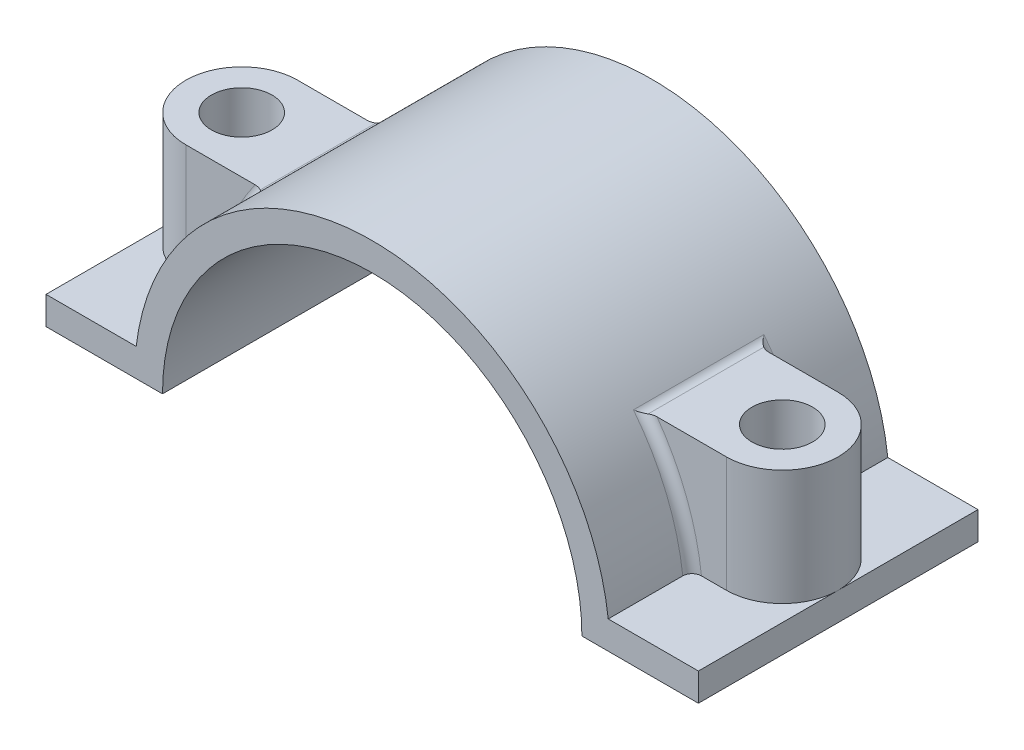
ISO-10303-21;
HEADER;
FILE_DESCRIPTION(('STEP AP214'),'2;1');
FILE_NAME('part.step','',(''),(''),'','','');
FILE_SCHEMA(('AUTOMOTIVE_DESIGN { 1 0 10303 214 1 1 1 1 }'));
ENDSEC;
DATA;
#1=APPLICATION_CONTEXT('core data for automotive mechanical design processes');
#2=APPLICATION_PROTOCOL_DEFINITION('international standard','automotive_design',2000,#1);
#3=PRODUCT_CONTEXT('',#1,'mechanical');
#4=PRODUCT('Part','Part','',(#3));
#5=PRODUCT_RELATED_PRODUCT_CATEGORY('part','',(#4));
#6=PRODUCT_DEFINITION_FORMATION('','',#4);
#7=PRODUCT_DEFINITION_CONTEXT('part definition',#1,'design');
#8=PRODUCT_DEFINITION('design','',#6,#7);
#9=PRODUCT_DEFINITION_SHAPE('','',#8);
#10=(LENGTH_UNIT() NAMED_UNIT(*) SI_UNIT(.MILLI.,.METRE.));
#11=(NAMED_UNIT(*) PLANE_ANGLE_UNIT() SI_UNIT($,.RADIAN.));
#12=(NAMED_UNIT(*) SI_UNIT($,.STERADIAN.) SOLID_ANGLE_UNIT());
#13=UNCERTAINTY_MEASURE_WITH_UNIT(LENGTH_MEASURE(1.E-05),#10,'distance_accuracy_value','');
#14=(GEOMETRIC_REPRESENTATION_CONTEXT(3) GLOBAL_UNCERTAINTY_ASSIGNED_CONTEXT((#13)) GLOBAL_UNIT_ASSIGNED_CONTEXT((#10,
#11,#12)) REPRESENTATION_CONTEXT('',''));
#15=CARTESIAN_POINT('',(0.,0.,0.));
#16=DIRECTION('',(0.,0.,1.));
#17=DIRECTION('',(1.,0.,0.));
#18=AXIS2_PLACEMENT_3D('',#15,#16,#17);
#19=CARTESIAN_POINT('',(-20.8156191356395,16.4,15.));
#20=DIRECTION('',(0.,0.,-1.));
#21=DIRECTION('',(-1.,0.,0.));
#22=AXIS2_PLACEMENT_3D('',#19,#20,#21);
#23=CYLINDRICAL_SURFACE('',#22,1.);
#24=CARTESIAN_POINT('',(-20.8156191356395,15.4,-6.20526054605057));
#25=CARTESIAN_POINT('',(-20.7790423955795,15.4000104684533,-6.22772458048017));
#26=CARTESIAN_POINT('',(-20.7432427208585,15.4020056715523,-6.25134656748978));
#27=CARTESIAN_POINT('',(-20.6734220101004,15.4095380975103,-6.30041681433598));
#28=CARTESIAN_POINT('',(-20.6393970203107,15.4150670480879,-6.325860686057));
#29=CARTESIAN_POINT('',(-20.573320367646,15.4292130596014,-6.37808157374734));
#30=CARTESIAN_POINT('',(-20.5412608609801,15.4378167625495,-6.40485239817953));
#31=CARTESIAN_POINT('',(-20.4790013902384,15.4577913917376,-6.45952765497965));
#32=CARTESIAN_POINT('',(-20.4488028796518,15.4691644474374,-6.48743294586012));
#33=CARTESIAN_POINT('',(-20.3410342500515,15.5156380340275,-6.59184700810215));
#34=CARTESIAN_POINT('',(-20.26931149113,15.5584479735794,-6.67108325177053));
#35=CARTESIAN_POINT('',(-20.1401526063457,15.6581165614313,-6.83208238582654));
#36=CARTESIAN_POINT('',(-20.0827128819923,15.7149716639601,-6.91384463396061));
#37=CARTESIAN_POINT('',(-20.0319539065668,15.7788148758067,-6.99699008960604));
#38=CARTESIAN_POINT('',(-20.031037697461,15.7799724883255,-6.99849506987035));
#39=CARTESIAN_POINT('',(-20.0301240739172,15.7811320754717,-7.));
#40=B_SPLINE_CURVE_WITH_KNOTS('',3,(#24,#25,#26,#27,#28,#29,#30,#31,#32,#33,#34,#35,#36,#37,#38,
#39),.UNSPECIFIED.,.F.,.F.,(4,2,2,2,2,2,2,4),(0.,0.128623315064683,0.256946628373384,
0.384719097488644,0.512590127663204,0.855754832598932,1.19883299227289,1.20515755519786),.UNSPECIFIED.);
#41=CARTESIAN_POINT('',(-20.8156191356395,15.4,-6.20526054605057));
#42=VERTEX_POINT('',#41);
#43=CARTESIAN_POINT('',(-20.0301240739172,15.7811320754717,-7.));
#44=VERTEX_POINT('',#43);
#45=EDGE_CURVE('E11',#42,#44,#40,.T.);
#46=ORIENTED_EDGE('',*,*,#45,.F.);
#47=DIRECTION('',(0.,0.,-1.));
#48=VECTOR('',#47,1.);
#49=CARTESIAN_POINT('',(-20.8156191356395,15.4,0.));
#50=LINE('',#49,#48);
#51=CARTESIAN_POINT('',(-20.8156191356395,15.4,6.20526054605057));
#52=VERTEX_POINT('',#51);
#53=EDGE_CURVE('E58',#52,#42,#50,.T.);
#54=ORIENTED_EDGE('',*,*,#53,.F.);
#55=CARTESIAN_POINT('',(-20.8156191356395,15.4,6.20526054605057));
#56=CARTESIAN_POINT('',(-20.7790423955795,15.4000104684533,6.22772458048016));
#57=CARTESIAN_POINT('',(-20.7432427208585,15.4020056715523,6.25134656748979));
#58=CARTESIAN_POINT('',(-20.6734220101004,15.4095380975103,6.300416814336));
#59=CARTESIAN_POINT('',(-20.6393970203107,15.4150670480879,6.32586068605703));
#60=CARTESIAN_POINT('',(-20.573320367646,15.4292130596014,6.37808157374736));
#61=CARTESIAN_POINT('',(-20.5412608609801,15.4378167625495,6.40485239817953));
#62=CARTESIAN_POINT('',(-20.4790013902384,15.4577913917376,6.45952765497967));
#63=CARTESIAN_POINT('',(-20.4488028796518,15.4691644474374,6.48743294586018));
#64=CARTESIAN_POINT('',(-20.3410342500514,15.5156380340276,6.591847008102));
#65=CARTESIAN_POINT('',(-20.2693114911294,15.5584479735801,6.67108325176955));
#66=CARTESIAN_POINT('',(-20.1401526063463,15.6581165614306,6.83208238582751));
#67=CARTESIAN_POINT('',(-20.0827128819947,15.7149716639571,6.91384463396438));
#68=CARTESIAN_POINT('',(-20.0319539065669,15.7788148758066,6.99699008960618));
#69=CARTESIAN_POINT('',(-20.0310376974611,15.7799724883255,6.99849506987042));
#70=CARTESIAN_POINT('',(-20.0301240739172,15.7811320754717,7.));
#71=B_SPLINE_CURVE_WITH_KNOTS('',3,(#55,#56,#57,#58,#59,#60,#61,#62,#63,#64,#65,#66,#67,#68,#69,
#70),.UNSPECIFIED.,.F.,.F.,(4,2,2,2,2,2,2,4),(0.,0.1286233150647,0.256946628373422,
0.384719097488662,0.512590127663204,0.855754832598924,1.19883299227289,1.20515755519786),.UNSPECIFIED.);
#72=CARTESIAN_POINT('',(-20.0301240739172,15.7811320754717,7.));
#73=VERTEX_POINT('',#72);
#74=EDGE_CURVE('E51',#52,#73,#71,.T.);
#75=ORIENTED_EDGE('',*,*,#74,.T.);
#76=DIRECTION('',(0.,0.,-1.));
#77=VECTOR('',#76,1.);
#78=CARTESIAN_POINT('',(-20.0301240739172,15.7811320754717,15.));
#79=LINE('',#78,#77);
#80=EDGE_CURVE('E583',#44,#73,#79,.F.);
#81=ORIENTED_EDGE('',*,*,#80,.F.);
#82=EDGE_LOOP('',(#46,#54,#75,#81));
#83=FACE_BOUND('',#82,.T.);
#84=ADVANCED_FACE('F38',(#83),#23,.F.);
#85=CARTESIAN_POINT('',(0.,0.,7.));
#86=DIRECTION('',(0.,0.,1.));
#87=DIRECTION('',(1.,0.,0.));
#88=AXIS2_PLACEMENT_3D('',#85,#86,#87);
#89=TOROIDAL_SURFACE('',#88,26.5,1.);
#90=ORIENTED_EDGE('',*,*,#74,.F.);
#91=CARTESIAN_POINT('',(-21.5659453769131,15.4,6.));
#92=CARTESIAN_POINT('',(-21.4800510751369,15.4,6.00001819834029));
#93=CARTESIAN_POINT('',(-21.3939987315737,15.4,6.00733615476593));
#94=CARTESIAN_POINT('',(-21.2264695965319,15.4,6.03626973627718));
#95=CARTESIAN_POINT('',(-21.1449326183364,15.4,6.05753994004215));
#96=CARTESIAN_POINT('',(-21.0226236279216,15.4,6.10131580582368));
#97=CARTESIAN_POINT('',(-20.9800688754925,15.4,6.11892696704098));
#98=CARTESIAN_POINT('',(-20.8964315910126,15.4,6.15867074133601));
#99=CARTESIAN_POINT('',(-20.8553763535309,15.4,6.18086066435772));
#100=CARTESIAN_POINT('',(-20.8156191356395,15.4,6.20526054605058));
#101=B_SPLINE_CURVE_WITH_KNOTS('',3,(#91,#92,#93,#94,#95,#96,#97,#98,#99,#100),.UNSPECIFIED.,
.F.,.F.,(4,2,2,2,4),(0.,0.257661941413872,0.50917408393543,0.647119728197683,0.786909918548286),.UNSPECIFIED.);
#102=CARTESIAN_POINT('',(-21.5659453769131,15.4,6.));
#103=VERTEX_POINT('',#102);
#104=EDGE_CURVE('E477',#103,#52,#101,.T.);
#105=ORIENTED_EDGE('',*,*,#104,.F.);
#106=CARTESIAN_POINT('',(0.,0.,6.));
#107=DIRECTION('',(0.,0.,1.));
#108=DIRECTION('',(1.,0.,0.));
#109=AXIS2_PLACEMENT_3D('',#106,#107,#108);
#110=CIRCLE('',#109,26.5);
#111=CARTESIAN_POINT('',(-26.3296410913632,3.,6.));
#112=VERTEX_POINT('',#111);
#113=EDGE_CURVE('E588',#112,#103,#110,.F.);
#114=ORIENTED_EDGE('',*,*,#113,.F.);
#115=CARTESIAN_POINT('',(-25.3229145242012,3.,7.));
#116=CARTESIAN_POINT('',(-25.3229146030695,3.,6.97200553198436));
#117=CARTESIAN_POINT('',(-25.3240990317966,3.,6.9440245268497));
#118=CARTESIAN_POINT('',(-25.3288234709458,3.,6.8882638723931));
#119=CARTESIAN_POINT('',(-25.3323633345418,3.,6.86048421062953));
#120=CARTESIAN_POINT('',(-25.3464792130386,3.,6.77780559336661));
#121=CARTESIAN_POINT('',(-25.3605516283502,3.,6.72346226824656));
#122=CARTESIAN_POINT('',(-25.3976134393538,3.,6.61791391386901));
#123=CARTESIAN_POINT('',(-25.420606488926,3.,6.56671018054942));
#124=CARTESIAN_POINT('',(-25.4748348297795,3.,6.46887243445492));
#125=CARTESIAN_POINT('',(-25.5060691439918,3.,6.42223788086477));
#126=CARTESIAN_POINT('',(-25.5759860524003,3.,6.334698208803));
#127=CARTESIAN_POINT('',(-25.6146915828095,3.,6.29381142147844));
#128=CARTESIAN_POINT('',(-25.6983864024311,3.,6.21905662929826));
#129=CARTESIAN_POINT('',(-25.7433770049755,3.,6.18519009508155));
#130=CARTESIAN_POINT('',(-25.8386754767127,3.,6.12520795238575));
#131=CARTESIAN_POINT('',(-25.8890169551633,3.,6.09914580094579));
#132=CARTESIAN_POINT('',(-25.993334704315,3.,6.05579884092153));
#133=CARTESIAN_POINT('',(-26.0473091559854,3.,6.03850967618809));
#134=CARTESIAN_POINT('',(-26.1395865249041,3.,6.01725243447755));
#135=CARTESIAN_POINT('',(-26.1773335799403,3.,6.01078691361844));
#136=CARTESIAN_POINT('',(-26.2532624413983,3.,6.00216105823388));
#137=CARTESIAN_POINT('',(-26.2914435605766,3.,5.9999946725953));
#138=CARTESIAN_POINT('',(-26.3296410913632,3.,6.));
#139=B_SPLINE_CURVE_WITH_KNOTS('',3,(#115,#116,#117,#118,#119,#120,#121,#122,#123,#124,#125,
#126,#127,#128,#129,#130,#131,#132,#133,#134,#135,#136,#137,#138),.UNSPECIFIED.,.F.,.F.,(4,2,2,
2,2,2,2,2,2,2,2,4),(0.,0.0839316434917921,0.167858055597521,0.335400679526094,0.503012001273137,
0.670603460256082,0.838717842173979,1.00686740605083,1.17614368611626,1.34533583108666,
1.45999665764598,1.57449598215896),.UNSPECIFIED.);
#140=CARTESIAN_POINT('',(-25.3229145242012,3.,7.));
#141=VERTEX_POINT('',#140);
#142=EDGE_CURVE('E521',#141,#112,#139,.T.);
#143=ORIENTED_EDGE('',*,*,#142,.F.);
#144=CARTESIAN_POINT('',(0.,0.,7.));
#145=DIRECTION('',(0.,0.,1.));
#146=DIRECTION('',(1.,0.,0.));
#147=AXIS2_PLACEMENT_3D('',#144,#145,#146);
#148=CIRCLE('',#147,25.5);
#149=EDGE_CURVE('E528',#73,#141,#148,.T.);
#150=ORIENTED_EDGE('',*,*,#149,.F.);
#151=EDGE_LOOP('',(#90,#105,#114,#143,#150));
#152=FACE_BOUND('',#151,.T.);
#153=ADVANCED_FACE('F497',(#152),#89,.F.);
#154=CARTESIAN_POINT('',(0.,0.,-7.));
#155=DIRECTION('',(0.,0.,-1.));
#156=DIRECTION('',(-1.,0.,0.));
#157=AXIS2_PLACEMENT_3D('',#154,#155,#156);
#158=TOROIDAL_SURFACE('',#157,26.5,1.);
#159=CARTESIAN_POINT('',(-20.8156191356395,15.4,-6.20526054605057));
#160=CARTESIAN_POINT('',(-20.8524464332746,15.4,-6.18266162688281));
#161=CARTESIAN_POINT('',(-20.8903784489619,15.4,-6.16195907669925));
#162=CARTESIAN_POINT('',(-20.968043718157,15.4,-6.12431649458518));
#163=CARTESIAN_POINT('',(-21.0077759826904,15.4,-6.10737442628364));
#164=CARTESIAN_POINT('',(-21.1271789405163,15.4,-6.062835375067));
#165=CARTESIAN_POINT('',(-21.2088642175461,15.4,-6.04044793843606));
#166=CARTESIAN_POINT('',(-21.3366541649774,15.4,-6.01679088691736));
#167=CARTESIAN_POINT('',(-21.3819261836167,15.4,-6.01054548284767));
#168=CARTESIAN_POINT('',(-21.4734331151285,15.4,-6.0021283240347));
#169=CARTESIAN_POINT('',(-21.5196729333387,15.4,-6.00000978565666));
#170=CARTESIAN_POINT('',(-21.5659453769131,15.4,-6.));
#171=B_SPLINE_CURVE_WITH_KNOTS('',3,(#159,#160,#161,#162,#163,#164,#165,#166,#167,#168,#169,
#170),.UNSPECIFIED.,.F.,.F.,(4,2,2,2,2,4),(0.,0.129481265844013,0.258892243172669,
0.511492650302673,0.648441096073207,0.787144112508083),.UNSPECIFIED.);
#172=CARTESIAN_POINT('',(-21.5659453769131,15.4,-6.));
#173=VERTEX_POINT('',#172);
#174=EDGE_CURVE('E484',#42,#173,#171,.T.);
#175=ORIENTED_EDGE('',*,*,#174,.F.);
#176=ORIENTED_EDGE('',*,*,#45,.T.);
#177=CARTESIAN_POINT('',(0.,0.,-7.));
#178=DIRECTION('',(0.,0.,-1.));
#179=DIRECTION('',(-1.,0.,0.));
#180=AXIS2_PLACEMENT_3D('',#177,#178,#179);
#181=CIRCLE('',#180,25.5);
#182=CARTESIAN_POINT('',(-25.3229145242012,3.,-7.));
#183=VERTEX_POINT('',#182);
#184=EDGE_CURVE('E597',#183,#44,#181,.T.);
#185=ORIENTED_EDGE('',*,*,#184,.F.);
#186=CARTESIAN_POINT('',(-26.3296410913629,3.,-6.));
#187=CARTESIAN_POINT('',(-26.3011811661531,3.,-6.00000028585972));
#188=CARTESIAN_POINT('',(-26.2727348538447,3.,-6.0012001227685));
#189=CARTESIAN_POINT('',(-26.2160449227091,3.,-6.00598711697197));
#190=CARTESIAN_POINT('',(-26.1878012963869,3.,-6.00957418552527));
#191=CARTESIAN_POINT('',(-26.1037170989265,3.,-6.02388463508139));
#192=CARTESIAN_POINT('',(-26.0484383430675,3.,-6.03815734028031));
#193=CARTESIAN_POINT('',(-25.9410608939852,3.,-6.07578506026414));
#194=CARTESIAN_POINT('',(-25.8889639140818,3.,-6.09914491926262));
#195=CARTESIAN_POINT('',(-25.7894489428435,3.,-6.15429943818504));
#196=CARTESIAN_POINT('',(-25.7420299075289,3.,-6.18609221026186));
#197=CARTESIAN_POINT('',(-25.6533636711956,3.,-6.25713073622443));
#198=CARTESIAN_POINT('',(-25.6120999525838,3.,-6.29635587828004));
#199=CARTESIAN_POINT('',(-25.5367850837961,3.,-6.38122612414712));
#200=CARTESIAN_POINT('',(-25.5027352406676,3.,-6.4268723888823));
#201=CARTESIAN_POINT('',(-25.4430522145314,3.,-6.52297854867846));
#202=CARTESIAN_POINT('',(-25.4173690011233,3.,-6.57340741178362));
#203=CARTESIAN_POINT('',(-25.3749089829741,3.,-6.67786834307877));
#204=CARTESIAN_POINT('',(-25.3581260831311,3.,-6.73189791681813));
#205=CARTESIAN_POINT('',(-25.3383540839355,3.,-6.82191189646598));
#206=CARTESIAN_POINT('',(-25.3325677367698,3.,-6.85730642554541));
#207=CARTESIAN_POINT('',(-25.3248486463745,3.,-6.92846209244694));
#208=CARTESIAN_POINT('',(-25.3229104275276,3.,-6.96422263646809));
#209=CARTESIAN_POINT('',(-25.3229145242012,3.,-7.));
#210=B_SPLINE_CURVE_WITH_KNOTS('',3,(#186,#187,#188,#189,#190,#191,#192,#193,#194,#195,#196,
#197,#198,#199,#200,#201,#202,#203,#204,#205,#206,#207,#208,#209),.UNSPECIFIED.,.F.,.F.,(4,2,2,
2,2,2,2,2,2,2,2,4),(0.,0.0853274391699519,0.170651706610478,0.341048874701205,0.511537003498997,
0.681986997873824,0.851971032591822,1.0219858396129,1.19096449614879,1.3598272830061,
1.46722706536691,1.57447391550913),.UNSPECIFIED.);
#211=CARTESIAN_POINT('',(-26.3296410913629,3.,-6.));
#212=VERTEX_POINT('',#211);
#213=EDGE_CURVE('E502',#212,#183,#210,.T.);
#214=ORIENTED_EDGE('',*,*,#213,.F.);
#215=CARTESIAN_POINT('',(0.,0.,-6.));
#216=DIRECTION('',(0.,0.,-1.));
#217=DIRECTION('',(-1.,0.,0.));
#218=AXIS2_PLACEMENT_3D('',#215,#216,#217);
#219=CIRCLE('',#218,26.5);
#220=EDGE_CURVE('E509',#173,#212,#219,.F.);
#221=ORIENTED_EDGE('',*,*,#220,.F.);
#222=EDGE_LOOP('',(#175,#176,#185,#214,#221));
#223=FACE_BOUND('',#222,.T.);
#224=ADVANCED_FACE('F494',(#223),#158,.F.);
#225=CARTESIAN_POINT('',(20.8156191356395,16.4,15.));
#226=DIRECTION('',(0.,0.,-1.));
#227=DIRECTION('',(-1.,0.,0.));
#228=AXIS2_PLACEMENT_3D('',#225,#226,#227);
#229=CYLINDRICAL_SURFACE('',#228,1.);
#230=CARTESIAN_POINT('',(20.8156191356395,15.4,6.20526054605057));
#231=CARTESIAN_POINT('',(20.7790423955795,15.4000104684533,6.22772458048016));
#232=CARTESIAN_POINT('',(20.7432427208585,15.4020056715523,6.25134656748979));
#233=CARTESIAN_POINT('',(20.6734220101004,15.4095380975103,6.300416814336));
#234=CARTESIAN_POINT('',(20.6393970203107,15.4150670480879,6.32586068605703));
#235=CARTESIAN_POINT('',(20.573320367646,15.4292130596014,6.37808157374736));
#236=CARTESIAN_POINT('',(20.5412608609801,15.4378167625495,6.40485239817953));
#237=CARTESIAN_POINT('',(20.4790013902384,15.4577913917376,6.45952765497967));
#238=CARTESIAN_POINT('',(20.4488028796518,15.4691644474374,6.48743294586018));
#239=CARTESIAN_POINT('',(20.3410342500514,15.5156380340276,6.591847008102));
#240=CARTESIAN_POINT('',(20.2693114911294,15.5584479735801,6.67108325176955));
#241=CARTESIAN_POINT('',(20.1401526063463,15.6581165614306,6.83208238582751));
#242=CARTESIAN_POINT('',(20.0827128819947,15.7149716639571,6.91384463396438));
#243=CARTESIAN_POINT('',(20.0319539065669,15.7788148758066,6.99699008960618));
#244=CARTESIAN_POINT('',(20.0310376974611,15.7799724883255,6.99849506987042));
#245=CARTESIAN_POINT('',(20.0301240739172,15.7811320754717,7.));
#246=B_SPLINE_CURVE_WITH_KNOTS('',3,(#230,#231,#232,#233,#234,#235,#236,#237,#238,#239,#240,
#241,#242,#243,#244,#245),.UNSPECIFIED.,.F.,.F.,(4,2,2,2,2,2,2,4),(0.,0.1286233150647,
0.256946628373422,0.384719097488662,0.512590127663204,0.855754832598924,1.19883299227289,
1.20515755519786),.UNSPECIFIED.);
#247=CARTESIAN_POINT('',(20.8156191356395,15.4,6.20526054605057));
#248=VERTEX_POINT('',#247);
#249=CARTESIAN_POINT('',(20.0301240739172,15.7811320754717,7.));
#250=VERTEX_POINT('',#249);
#251=EDGE_CURVE('E603',#248,#250,#246,.T.);
#252=ORIENTED_EDGE('',*,*,#251,.F.);
#253=DIRECTION('',(0.,0.,-1.));
#254=VECTOR('',#253,1.);
#255=CARTESIAN_POINT('',(20.8156191356395,15.4,0.));
#256=LINE('',#255,#254);
#257=CARTESIAN_POINT('',(20.8156191356395,15.4,-6.20526054605057));
#258=VERTEX_POINT('',#257);
#259=EDGE_CURVE('E387',#258,#248,#256,.F.);
#260=ORIENTED_EDGE('',*,*,#259,.F.);
#261=CARTESIAN_POINT('',(20.8156191356395,15.4,-6.20526054605057));
#262=CARTESIAN_POINT('',(20.7790423955795,15.4000104684533,-6.22772458048017));
#263=CARTESIAN_POINT('',(20.7432427208585,15.4020056715523,-6.25134656748978));
#264=CARTESIAN_POINT('',(20.6734220101004,15.4095380975103,-6.30041681433598));
#265=CARTESIAN_POINT('',(20.6393970203107,15.4150670480879,-6.325860686057));
#266=CARTESIAN_POINT('',(20.573320367646,15.4292130596014,-6.37808157374734));
#267=CARTESIAN_POINT('',(20.5412608609801,15.4378167625495,-6.40485239817953));
#268=CARTESIAN_POINT('',(20.4790013902384,15.4577913917376,-6.45952765497965));
#269=CARTESIAN_POINT('',(20.4488028796518,15.4691644474374,-6.48743294586012));
#270=CARTESIAN_POINT('',(20.3410342500515,15.5156380340275,-6.59184700810215));
#271=CARTESIAN_POINT('',(20.26931149113,15.5584479735794,-6.67108325177053));
#272=CARTESIAN_POINT('',(20.1401526063457,15.6581165614313,-6.83208238582654));
#273=CARTESIAN_POINT('',(20.0827128819923,15.7149716639601,-6.91384463396061));
#274=CARTESIAN_POINT('',(20.0319539065668,15.7788148758067,-6.99699008960604));
#275=CARTESIAN_POINT('',(20.031037697461,15.7799724883255,-6.99849506987035));
#276=CARTESIAN_POINT('',(20.0301240739172,15.7811320754717,-7.));
#277=B_SPLINE_CURVE_WITH_KNOTS('',3,(#261,#262,#263,#264,#265,#266,#267,#268,#269,#270,#271,
#272,#273,#274,#275,#276),.UNSPECIFIED.,.F.,.F.,(4,2,2,2,2,2,2,4),(0.,0.128623315064683,
0.256946628373384,0.384719097488644,0.512590127663204,0.855754832598932,1.19883299227289,
1.20515755519786),.UNSPECIFIED.);
#278=CARTESIAN_POINT('',(20.0301240739172,15.7811320754717,-7.));
#279=VERTEX_POINT('',#278);
#280=EDGE_CURVE('E436',#258,#279,#277,.T.);
#281=ORIENTED_EDGE('',*,*,#280,.T.);
#282=DIRECTION('',(0.,0.,-1.));
#283=VECTOR('',#282,1.);
#284=CARTESIAN_POINT('',(20.0301240739172,15.7811320754717,15.));
#285=LINE('',#284,#283);
#286=EDGE_CURVE('E370',#250,#279,#285,.T.);
#287=ORIENTED_EDGE('',*,*,#286,.F.);
#288=EDGE_LOOP('',(#252,#260,#281,#287));
#289=FACE_BOUND('',#288,.T.);
#290=ADVANCED_FACE('F423',(#289),#229,.F.);
#291=CARTESIAN_POINT('',(0.,0.,-7.));
#292=DIRECTION('',(0.,0.,1.));
#293=DIRECTION('',(1.,0.,0.));
#294=AXIS2_PLACEMENT_3D('',#291,#292,#293);
#295=TOROIDAL_SURFACE('',#294,26.5,1.);
#296=ORIENTED_EDGE('',*,*,#280,.F.);
#297=CARTESIAN_POINT('',(21.5659453769131,15.4,-6.));
#298=CARTESIAN_POINT('',(21.4800510751369,15.4,-6.00001819834029));
#299=CARTESIAN_POINT('',(21.3939987315737,15.4,-6.00733615476593));
#300=CARTESIAN_POINT('',(21.2264695965319,15.4,-6.03626973627718));
#301=CARTESIAN_POINT('',(21.1449326183364,15.4,-6.05753994004215));
#302=CARTESIAN_POINT('',(21.0226236279216,15.4,-6.10131580582368));
#303=CARTESIAN_POINT('',(20.9800688754925,15.4,-6.11892696704098));
#304=CARTESIAN_POINT('',(20.8964315910126,15.4,-6.15867074133601));
#305=CARTESIAN_POINT('',(20.8553763535309,15.4,-6.18086066435772));
#306=CARTESIAN_POINT('',(20.8156191356395,15.4,-6.20526054605058));
#307=B_SPLINE_CURVE_WITH_KNOTS('',3,(#297,#298,#299,#300,#301,#302,#303,#304,#305,#306),
.UNSPECIFIED.,.F.,.F.,(4,2,2,2,4),(0.,0.257661941413872,0.50917408393543,0.647119728197683,
0.786909918548286),.UNSPECIFIED.);
#308=CARTESIAN_POINT('',(21.5659453769131,15.4,-6.));
#309=VERTEX_POINT('',#308);
#310=EDGE_CURVE('E412',#309,#258,#307,.T.);
#311=ORIENTED_EDGE('',*,*,#310,.F.);
#312=CARTESIAN_POINT('',(0.,0.,-6.));
#313=DIRECTION('',(0.,0.,1.));
#314=DIRECTION('',(1.,0.,0.));
#315=AXIS2_PLACEMENT_3D('',#312,#313,#314);
#316=CIRCLE('',#315,26.5);
#317=CARTESIAN_POINT('',(26.3296410913629,3.,-6.));
#318=VERTEX_POINT('',#317);
#319=EDGE_CURVE('E362',#318,#309,#316,.T.);
#320=ORIENTED_EDGE('',*,*,#319,.F.);
#321=CARTESIAN_POINT('',(25.3229145242012,3.,-7.));
#322=CARTESIAN_POINT('',(25.3229146030695,3.,-6.97200553198436));
#323=CARTESIAN_POINT('',(25.3240990317966,3.,-6.9440245268497));
#324=CARTESIAN_POINT('',(25.3288234709458,3.,-6.8882638723931));
#325=CARTESIAN_POINT('',(25.3323633345418,3.,-6.86048421062953));
#326=CARTESIAN_POINT('',(25.3464792130386,3.,-6.77780559336661));
#327=CARTESIAN_POINT('',(25.3605516283502,3.,-6.72346226824656));
#328=CARTESIAN_POINT('',(25.3976134393538,3.,-6.61791391386901));
#329=CARTESIAN_POINT('',(25.420606488926,3.,-6.56671018054942));
#330=CARTESIAN_POINT('',(25.4748348297795,3.,-6.46887243445492));
#331=CARTESIAN_POINT('',(25.5060691439918,3.,-6.42223788086477));
#332=CARTESIAN_POINT('',(25.5759860524003,3.,-6.334698208803));
#333=CARTESIAN_POINT('',(25.6146915828095,3.,-6.29381142147844));
#334=CARTESIAN_POINT('',(25.6983864024311,3.,-6.21905662929826));
#335=CARTESIAN_POINT('',(25.7433770049755,3.,-6.18519009508155));
#336=CARTESIAN_POINT('',(25.8386754767127,3.,-6.12520795238575));
#337=CARTESIAN_POINT('',(25.8890169551633,3.,-6.09914580094579));
#338=CARTESIAN_POINT('',(25.993334704315,3.,-6.05579884092153));
#339=CARTESIAN_POINT('',(26.0473091559854,3.,-6.03850967618809));
#340=CARTESIAN_POINT('',(26.1395865249041,3.,-6.01725243447756));
#341=CARTESIAN_POINT('',(26.1773335799403,3.,-6.01078691361845));
#342=CARTESIAN_POINT('',(26.2532624413981,3.,-6.00216105823389));
#343=CARTESIAN_POINT('',(26.2914435605763,3.,-5.9999946725953));
#344=CARTESIAN_POINT('',(26.3296410913629,3.,-6.));
#345=B_SPLINE_CURVE_WITH_KNOTS('',3,(#321,#322,#323,#324,#325,#326,#327,#328,#329,#330,#331,
#332,#333,#334,#335,#336,#337,#338,#339,#340,#341,#342,#343,#344),.UNSPECIFIED.,.F.,.F.,(4,2,2,
2,2,2,2,2,2,2,2,4),(0.,0.0839316434917937,0.167858055597521,0.335400679526094,0.503012001273135,
0.670603460256083,0.838717842173979,1.00686740605083,1.17614368611626,1.34533583108666,
1.45999665764586,1.57449598215871),.UNSPECIFIED.);
#346=CARTESIAN_POINT('',(25.3229145242012,3.,-7.));
#347=VERTEX_POINT('',#346);
#348=EDGE_CURVE('E378',#347,#318,#345,.T.);
#349=ORIENTED_EDGE('',*,*,#348,.F.);
#350=CARTESIAN_POINT('',(0.,0.,-7.));
#351=DIRECTION('',(0.,0.,1.));
#352=DIRECTION('',(1.,0.,0.));
#353=AXIS2_PLACEMENT_3D('',#350,#351,#352);
#354=CIRCLE('',#353,25.5);
#355=EDGE_CURVE('E374',#279,#347,#354,.F.);
#356=ORIENTED_EDGE('',*,*,#355,.F.);
#357=EDGE_LOOP('',(#296,#311,#320,#349,#356));
#358=FACE_BOUND('',#357,.T.);
#359=ADVANCED_FACE('F389',(#358),#295,.F.);
#360=CARTESIAN_POINT('',(0.,0.,7.));
#361=DIRECTION('',(0.,0.,-1.));
#362=DIRECTION('',(-1.,0.,0.));
#363=AXIS2_PLACEMENT_3D('',#360,#361,#362);
#364=TOROIDAL_SURFACE('',#363,26.5,1.);
#365=CARTESIAN_POINT('',(20.8156191356395,15.4,6.20526054605057));
#366=CARTESIAN_POINT('',(20.8524464332746,15.4,6.18266162688281));
#367=CARTESIAN_POINT('',(20.8903784489619,15.4,6.16195907669925));
#368=CARTESIAN_POINT('',(20.968043718157,15.4,6.12431649458518));
#369=CARTESIAN_POINT('',(21.0077759826904,15.4,6.10737442628364));
#370=CARTESIAN_POINT('',(21.1271789405163,15.4,6.062835375067));
#371=CARTESIAN_POINT('',(21.2088642175461,15.4,6.04044793843606));
#372=CARTESIAN_POINT('',(21.3366541649774,15.4,6.01679088691736));
#373=CARTESIAN_POINT('',(21.3819261836167,15.4,6.01054548284767));
#374=CARTESIAN_POINT('',(21.4734331151285,15.4,6.0021283240347));
#375=CARTESIAN_POINT('',(21.5196729333387,15.4,6.00000978565666));
#376=CARTESIAN_POINT('',(21.5659453769131,15.4,6.));
#377=B_SPLINE_CURVE_WITH_KNOTS('',3,(#365,#366,#367,#368,#369,#370,#371,#372,#373,#374,#375,
#376),.UNSPECIFIED.,.F.,.F.,(4,2,2,2,2,4),(0.,0.129481265844013,0.258892243172669,
0.511492650302673,0.648441096073207,0.787144112508083),.UNSPECIFIED.);
#378=CARTESIAN_POINT('',(21.5659453769131,15.4,6.));
#379=VERTEX_POINT('',#378);
#380=EDGE_CURVE('E429',#248,#379,#377,.T.);
#381=ORIENTED_EDGE('',*,*,#380,.F.);
#382=ORIENTED_EDGE('',*,*,#251,.T.);
#383=CARTESIAN_POINT('',(0.,0.,7.));
#384=DIRECTION('',(0.,0.,-1.));
#385=DIRECTION('',(-1.,0.,0.));
#386=AXIS2_PLACEMENT_3D('',#383,#384,#385);
#387=CIRCLE('',#386,25.5);
#388=CARTESIAN_POINT('',(25.3229145242012,3.,7.));
#389=VERTEX_POINT('',#388);
#390=EDGE_CURVE('E366',#389,#250,#387,.F.);
#391=ORIENTED_EDGE('',*,*,#390,.F.);
#392=CARTESIAN_POINT('',(26.3296410913632,3.,6.));
#393=CARTESIAN_POINT('',(26.3011811661533,3.,6.00000028585971));
#394=CARTESIAN_POINT('',(26.2727348538449,3.,6.00120012276848));
#395=CARTESIAN_POINT('',(26.2160449227093,3.,6.00598711697194));
#396=CARTESIAN_POINT('',(26.1878012963871,3.,6.00957418552523));
#397=CARTESIAN_POINT('',(26.1037170989268,3.,6.02388463508133));
#398=CARTESIAN_POINT('',(26.0484383430678,3.,6.03815734028024));
#399=CARTESIAN_POINT('',(25.9410608939854,3.,6.07578506026405));
#400=CARTESIAN_POINT('',(25.888963914082,3.,6.09914491926251));
#401=CARTESIAN_POINT('',(25.7894489428437,3.,6.15429943818491));
#402=CARTESIAN_POINT('',(25.7420299075291,3.,6.18609221026172));
#403=CARTESIAN_POINT('',(25.6533636711957,3.,6.25713073622427));
#404=CARTESIAN_POINT('',(25.612099952584,3.,6.29635587827986));
#405=CARTESIAN_POINT('',(25.5367850837962,3.,6.38122612414693));
#406=CARTESIAN_POINT('',(25.5027352406677,3.,6.4268723888821));
#407=CARTESIAN_POINT('',(25.4430522145315,3.,6.52297854867825));
#408=CARTESIAN_POINT('',(25.4173690011234,3.,6.5734074117834));
#409=CARTESIAN_POINT('',(25.3749089829741,3.,6.67786834307854));
#410=CARTESIAN_POINT('',(25.3581260831312,3.,6.73189791681789));
#411=CARTESIAN_POINT('',(25.3383540839356,3.,6.82191189646578));
#412=CARTESIAN_POINT('',(25.3325677367698,3.,6.85730642554525));
#413=CARTESIAN_POINT('',(25.3248486463745,3.,6.92846209244686));
#414=CARTESIAN_POINT('',(25.3229104275276,3.,6.96422263646805));
#415=CARTESIAN_POINT('',(25.3229145242012,3.,7.));
#416=B_SPLINE_CURVE_WITH_KNOTS('',3,(#392,#393,#394,#395,#396,#397,#398,#399,#400,#401,#402,
#403,#404,#405,#406,#407,#408,#409,#410,#411,#412,#413,#414,#415),.UNSPECIFIED.,.F.,.F.,(4,2,2,
2,2,2,2,2,2,2,2,4),(0.,0.085327439169951,0.170651706610474,0.341048874701209,0.511537003499001,
0.681986997873827,0.851971032591828,1.0219858396129,1.1909644961488,1.3598272830061,
1.46722706536703,1.57447391550937),.UNSPECIFIED.);
#417=CARTESIAN_POINT('',(26.3296410913632,3.,6.));
#418=VERTEX_POINT('',#417);
#419=EDGE_CURVE('E405',#418,#389,#416,.T.);
#420=ORIENTED_EDGE('',*,*,#419,.F.);
#421=CARTESIAN_POINT('',(0.,0.,6.));
#422=DIRECTION('',(0.,0.,-1.));
#423=DIRECTION('',(-1.,0.,0.));
#424=AXIS2_PLACEMENT_3D('',#421,#422,#423);
#425=CIRCLE('',#424,26.5);
#426=EDGE_CURVE('E202',#379,#418,#425,.T.);
#427=ORIENTED_EDGE('',*,*,#426,.F.);
#428=EDGE_LOOP('',(#381,#382,#391,#420,#427));
#429=FACE_BOUND('',#428,.T.);
#430=ADVANCED_FACE('F398',(#429),#364,.F.);
#431=CARTESIAN_POINT('',(35.,3.,15.));
#432=DIRECTION('',(0.,-1.,0.));
#433=DIRECTION('',(1.,0.,0.));
#434=AXIS2_PLACEMENT_3D('',#431,#432,#433);
#435=PLANE('',#434);
#436=DIRECTION('',(-1.,0.,0.));
#437=VECTOR('',#436,1.);
#438=CARTESIAN_POINT('',(20.12,3.,6.));
#439=LINE('',#438,#437);
#440=CARTESIAN_POINT('',(29.,3.,6.));
#441=VERTEX_POINT('',#440);
#442=EDGE_CURVE('E195',#441,#418,#439,.T.);
#443=ORIENTED_EDGE('',*,*,#442,.T.);
#444=ORIENTED_EDGE('',*,*,#419,.T.);
#445=DIRECTION('',(0.,0.,-1.));
#446=VECTOR('',#445,1.);
#447=CARTESIAN_POINT('',(25.3229145242012,3.,15.));
#448=LINE('',#447,#446);
#449=CARTESIAN_POINT('',(25.3229145242012,3.,15.));
#450=VERTEX_POINT('',#449);
#451=EDGE_CURVE('E347',#450,#389,#448,.T.);
#452=ORIENTED_EDGE('',*,*,#451,.F.);
#453=DIRECTION('',(-1.,0.,0.));
#454=VECTOR('',#453,1.);
#455=CARTESIAN_POINT('',(35.,3.,15.));
#456=LINE('',#455,#454);
#457=CARTESIAN_POINT('',(35.,3.,15.));
#458=VERTEX_POINT('',#457);
#459=EDGE_CURVE('E286',#458,#450,#456,.T.);
#460=ORIENTED_EDGE('',*,*,#459,.F.);
#461=DIRECTION('',(0.,0.,-1.));
#462=VECTOR('',#461,1.);
#463=CARTESIAN_POINT('',(35.,3.,15.));
#464=LINE('',#463,#462);
#465=CARTESIAN_POINT('',(35.,3.,0.));
#466=VERTEX_POINT('',#465);
#467=EDGE_CURVE('E225',#458,#466,#464,.T.);
#468=ORIENTED_EDGE('',*,*,#467,.T.);
#469=CARTESIAN_POINT('',(29.,3.,0.));
#470=DIRECTION('',(0.,-1.,0.));
#471=DIRECTION('',(1.,0.,0.));
#472=AXIS2_PLACEMENT_3D('',#469,#470,#471);
#473=CIRCLE('',#472,6.);
#474=EDGE_CURVE('E212',#466,#441,#473,.T.);
#475=ORIENTED_EDGE('',*,*,#474,.T.);
#476=EDGE_LOOP('',(#443,#444,#452,#460,#468,#475));
#477=FACE_BOUND('',#476,.T.);
#478=ADVANCED_FACE('F222',(#477),#435,.F.);
#479=CARTESIAN_POINT('',(25.3229145242012,3.,-15.));
#480=VERTEX_POINT('',#479);
#481=EDGE_CURVE('E346',#347,#480,#448,.T.);
#482=ORIENTED_EDGE('',*,*,#481,.F.);
#483=ORIENTED_EDGE('',*,*,#348,.T.);
#484=DIRECTION('',(1.,0.,0.));
#485=VECTOR('',#484,1.);
#486=CARTESIAN_POINT('',(20.12,3.,-6.));
#487=LINE('',#486,#485);
#488=CARTESIAN_POINT('',(29.,3.,-6.));
#489=VERTEX_POINT('',#488);
#490=EDGE_CURVE('E206',#318,#489,#487,.T.);
#491=ORIENTED_EDGE('',*,*,#490,.T.);
#492=EDGE_CURVE('E207',#489,#466,#473,.T.);
#493=ORIENTED_EDGE('',*,*,#492,.T.);
#494=CARTESIAN_POINT('',(35.,3.,-15.));
#495=VERTEX_POINT('',#494);
#496=EDGE_CURVE('E351',#466,#495,#464,.T.);
#497=ORIENTED_EDGE('',*,*,#496,.T.);
#498=DIRECTION('',(-1.,0.,0.));
#499=VECTOR('',#498,1.);
#500=CARTESIAN_POINT('',(35.,3.,-15.));
#501=LINE('',#500,#499);
#502=EDGE_CURVE('E312',#495,#480,#501,.T.);
#503=ORIENTED_EDGE('',*,*,#502,.T.);
#504=EDGE_LOOP('',(#482,#483,#491,#493,#497,#503));
#505=FACE_BOUND('',#504,.T.);
#506=ADVANCED_FACE('F397',(#505),#435,.F.);
#507=CARTESIAN_POINT('',(0.,0.,15.));
#508=DIRECTION('',(0.,0.,-1.));
#509=DIRECTION('',(-1.,0.,0.));
#510=AXIS2_PLACEMENT_3D('',#507,#508,#509);
#511=CYLINDRICAL_SURFACE('',#510,25.5);
#512=ORIENTED_EDGE('',*,*,#80,.T.);
#513=ORIENTED_EDGE('',*,*,#149,.T.);
#514=DIRECTION('',(0.,0.,-1.));
#515=VECTOR('',#514,1.);
#516=CARTESIAN_POINT('',(-25.3229145242012,3.,15.));
#517=LINE('',#516,#515);
#518=CARTESIAN_POINT('',(-25.3229145242012,3.,15.));
#519=VERTEX_POINT('',#518);
#520=EDGE_CURVE('E342',#519,#141,#517,.T.);
#521=ORIENTED_EDGE('',*,*,#520,.F.);
#522=CARTESIAN_POINT('',(0.,0.,15.));
#523=DIRECTION('',(0.,0.,1.));
#524=DIRECTION('',(1.,0.,0.));
#525=AXIS2_PLACEMENT_3D('',#522,#523,#524);
#526=CIRCLE('',#525,25.5);
#527=EDGE_CURVE('E289',#450,#519,#526,.T.);
#528=ORIENTED_EDGE('',*,*,#527,.F.);
#529=ORIENTED_EDGE('',*,*,#451,.T.);
#530=ORIENTED_EDGE('',*,*,#390,.T.);
#531=ORIENTED_EDGE('',*,*,#286,.T.);
#532=ORIENTED_EDGE('',*,*,#355,.T.);
#533=ORIENTED_EDGE('',*,*,#481,.T.);
#534=CARTESIAN_POINT('',(0.,0.,-15.));
#535=DIRECTION('',(0.,0.,1.));
#536=DIRECTION('',(1.,0.,0.));
#537=AXIS2_PLACEMENT_3D('',#534,#535,#536);
#538=CIRCLE('',#537,25.5);
#539=CARTESIAN_POINT('',(-25.3229145242012,3.,-15.));
#540=VERTEX_POINT('',#539);
#541=EDGE_CURVE('E316',#480,#540,#538,.T.);
#542=ORIENTED_EDGE('',*,*,#541,.T.);
#543=EDGE_CURVE('E341',#183,#540,#517,.T.);
#544=ORIENTED_EDGE('',*,*,#543,.F.);
#545=ORIENTED_EDGE('',*,*,#184,.T.);
#546=EDGE_LOOP('',(#512,#513,#521,#528,#529,#530,#531,#532,#533,#542,#544,#545));
#547=FACE_BOUND('',#546,.T.);
#548=ADVANCED_FACE('F399',(#547),#511,.T.);
#549=CARTESIAN_POINT('',(-35.,3.,15.));
#550=DIRECTION('',(0.,-1.,0.));
#551=DIRECTION('',(1.,0.,0.));
#552=AXIS2_PLACEMENT_3D('',#549,#550,#551);
#553=PLANE('',#552);
#554=DIRECTION('',(-1.,0.,0.));
#555=VECTOR('',#554,1.);
#556=CARTESIAN_POINT('',(-20.12,3.,-6.));
#557=LINE('',#556,#555);
#558=CARTESIAN_POINT('',(-29.,3.,-6.));
#559=VERTEX_POINT('',#558);
#560=EDGE_CURVE('E240',#212,#559,#557,.T.);
#561=ORIENTED_EDGE('',*,*,#560,.F.);
#562=ORIENTED_EDGE('',*,*,#213,.T.);
#563=ORIENTED_EDGE('',*,*,#543,.T.);
#564=DIRECTION('',(-1.,0.,0.));
#565=VECTOR('',#564,1.);
#566=CARTESIAN_POINT('',(-35.,3.,-15.));
#567=LINE('',#566,#565);
#568=CARTESIAN_POINT('',(-35.,3.,-15.));
#569=VERTEX_POINT('',#568);
#570=EDGE_CURVE('E320',#540,#569,#567,.T.);
#571=ORIENTED_EDGE('',*,*,#570,.T.);
#572=DIRECTION('',(0.,0.,-1.));
#573=VECTOR('',#572,1.);
#574=CARTESIAN_POINT('',(-35.,3.,15.));
#575=LINE('',#574,#573);
#576=CARTESIAN_POINT('',(-35.,3.,0.));
#577=VERTEX_POINT('',#576);
#578=EDGE_CURVE('E336',#577,#569,#575,.T.);
#579=ORIENTED_EDGE('',*,*,#578,.F.);
#580=CARTESIAN_POINT('',(-29.,3.,0.));
#581=DIRECTION('',(0.,-1.,0.));
#582=DIRECTION('',(1.,0.,0.));
#583=AXIS2_PLACEMENT_3D('',#580,#581,#582);
#584=CIRCLE('',#583,6.);
#585=EDGE_CURVE('E249',#559,#577,#584,.F.);
#586=ORIENTED_EDGE('',*,*,#585,.F.);
#587=EDGE_LOOP('',(#561,#562,#563,#571,#579,#586));
#588=FACE_BOUND('',#587,.T.);
#589=ADVANCED_FACE('F517',(#588),#553,.F.);
#590=CARTESIAN_POINT('',(0.,0.,15.));
#591=DIRECTION('',(0.,0.,-1.));
#592=DIRECTION('',(-1.,0.,0.));
#593=AXIS2_PLACEMENT_3D('',#590,#591,#592);
#594=CYLINDRICAL_SURFACE('',#593,22.5);
#595=CARTESIAN_POINT('',(0.,0.,-15.));
#596=DIRECTION('',(0.,0.,-1.));
#597=DIRECTION('',(1.,0.,0.));
#598=AXIS2_PLACEMENT_3D('',#595,#596,#597);
#599=CIRCLE('',#598,22.5);
#600=CARTESIAN_POINT('',(-22.5,0.,-15.));
#601=VERTEX_POINT('',#600);
#602=CARTESIAN_POINT('',(22.5,0.,-15.));
#603=VERTEX_POINT('',#602);
#604=EDGE_CURVE('E274',#601,#603,#599,.T.);
#605=ORIENTED_EDGE('',*,*,#604,.T.);
#606=DIRECTION('',(0.,0.,-1.));
#607=VECTOR('',#606,1.);
#608=CARTESIAN_POINT('',(22.5,0.,15.));
#609=LINE('',#608,#607);
#610=CARTESIAN_POINT('',(22.5,0.,15.));
#611=VERTEX_POINT('',#610);
#612=EDGE_CURVE('E358',#611,#603,#609,.T.);
#613=ORIENTED_EDGE('',*,*,#612,.F.);
#614=CARTESIAN_POINT('',(0.,0.,15.));
#615=DIRECTION('',(0.,0.,-1.));
#616=DIRECTION('',(1.,0.,0.));
#617=AXIS2_PLACEMENT_3D('',#614,#615,#616);
#618=CIRCLE('',#617,22.5);
#619=CARTESIAN_POINT('',(-22.5,0.,15.));
#620=VERTEX_POINT('',#619);
#621=EDGE_CURVE('E275',#620,#611,#618,.T.);
#622=ORIENTED_EDGE('',*,*,#621,.F.);
#623=DIRECTION('',(0.,0.,-1.));
#624=VECTOR('',#623,1.);
#625=CARTESIAN_POINT('',(-22.5,0.,15.));
#626=LINE('',#625,#624);
#627=EDGE_CURVE('E301',#620,#601,#626,.T.);
#628=ORIENTED_EDGE('',*,*,#627,.T.);
#629=EDGE_LOOP('',(#605,#613,#622,#628));
#630=FACE_BOUND('',#629,.T.);
#631=ADVANCED_FACE('F648',(#630),#594,.F.);
#632=CARTESIAN_POINT('',(22.5,0.,15.));
#633=DIRECTION('',(0.,1.,0.));
#634=DIRECTION('',(-1.,0.,0.));
#635=AXIS2_PLACEMENT_3D('',#632,#633,#634);
#636=PLANE('',#635);
#637=CARTESIAN_POINT('',(29.,0.,0.));
#638=DIRECTION('',(0.,-1.,0.));
#639=DIRECTION('',(1.,0.,0.));
#640=AXIS2_PLACEMENT_3D('',#637,#638,#639);
#641=CIRCLE('',#640,3.25);
#642=CARTESIAN_POINT('',(32.25,0.,0.));
#643=VERTEX_POINT('',#642);
#644=EDGE_CURVE('E227',#643,#643,#641,.T.);
#645=ORIENTED_EDGE('',*,*,#644,.F.);
#646=EDGE_LOOP('',(#645));
#647=FACE_BOUND('',#646,.T.);
#648=DIRECTION('',(1.,0.,0.));
#649=VECTOR('',#648,1.);
#650=CARTESIAN_POINT('',(22.5,0.,-15.));
#651=LINE('',#650,#649);
#652=CARTESIAN_POINT('',(35.,0.,-15.));
#653=VERTEX_POINT('',#652);
#654=EDGE_CURVE('E305',#603,#653,#651,.T.);
#655=ORIENTED_EDGE('',*,*,#654,.T.);
#656=DIRECTION('',(0.,0.,-1.));
#657=VECTOR('',#656,1.);
#658=CARTESIAN_POINT('',(35.,0.,15.));
#659=LINE('',#658,#657);
#660=CARTESIAN_POINT('',(35.,0.,15.));
#661=VERTEX_POINT('',#660);
#662=EDGE_CURVE('E354',#661,#653,#659,.T.);
#663=ORIENTED_EDGE('',*,*,#662,.F.);
#664=DIRECTION('',(1.,0.,0.));
#665=VECTOR('',#664,1.);
#666=CARTESIAN_POINT('',(22.5,0.,15.));
#667=LINE('',#666,#665);
#668=EDGE_CURVE('E279',#611,#661,#667,.T.);
#669=ORIENTED_EDGE('',*,*,#668,.F.);
#670=ORIENTED_EDGE('',*,*,#612,.T.);
#671=EDGE_LOOP('',(#655,#663,#669,#670));
#672=FACE_BOUND('',#671,.T.);
#673=ADVANCED_FACE('F651',(#647,#672),#636,.F.);
#674=CARTESIAN_POINT('',(35.,0.,15.));
#675=DIRECTION('',(-1.,0.,0.));
#676=DIRECTION('',(0.,0.,1.));
#677=AXIS2_PLACEMENT_3D('',#674,#675,#676);
#678=PLANE('',#677);
#679=DIRECTION('',(0.,1.,0.));
#680=VECTOR('',#679,1.);
#681=CARTESIAN_POINT('',(35.,0.,-15.));
#682=LINE('',#681,#680);
#683=EDGE_CURVE('E308',#653,#495,#682,.T.);
#684=ORIENTED_EDGE('',*,*,#683,.T.);
#685=ORIENTED_EDGE('',*,*,#496,.F.);
#686=ORIENTED_EDGE('',*,*,#467,.F.);
#687=DIRECTION('',(0.,1.,0.));
#688=VECTOR('',#687,1.);
#689=CARTESIAN_POINT('',(35.,0.,15.));
#690=LINE('',#689,#688);
#691=EDGE_CURVE('E283',#661,#458,#690,.T.);
#692=ORIENTED_EDGE('',*,*,#691,.F.);
#693=ORIENTED_EDGE('',*,*,#662,.T.);
#694=EDGE_LOOP('',(#684,#685,#686,#692,#693));
#695=FACE_BOUND('',#694,.T.);
#696=ADVANCED_FACE('F401',(#695),#678,.F.);
#697=ORIENTED_EDGE('',*,*,#520,.T.);
#698=ORIENTED_EDGE('',*,*,#142,.T.);
#699=DIRECTION('',(1.,0.,0.));
#700=VECTOR('',#699,1.);
#701=CARTESIAN_POINT('',(-20.12,3.,6.));
#702=LINE('',#701,#700);
#703=CARTESIAN_POINT('',(-29.,3.,6.));
#704=VERTEX_POINT('',#703);
#705=EDGE_CURVE('E252',#704,#112,#702,.T.);
#706=ORIENTED_EDGE('',*,*,#705,.F.);
#707=EDGE_CURVE('E248',#577,#704,#584,.F.);
#708=ORIENTED_EDGE('',*,*,#707,.F.);
#709=CARTESIAN_POINT('',(-35.,3.,15.));
#710=VERTEX_POINT('',#709);
#711=EDGE_CURVE('E337',#710,#577,#575,.T.);
#712=ORIENTED_EDGE('',*,*,#711,.F.);
#713=DIRECTION('',(-1.,0.,0.));
#714=VECTOR('',#713,1.);
#715=CARTESIAN_POINT('',(-35.,3.,15.));
#716=LINE('',#715,#714);
#717=EDGE_CURVE('E292',#519,#710,#716,.T.);
#718=ORIENTED_EDGE('',*,*,#717,.F.);
#719=EDGE_LOOP('',(#697,#698,#706,#708,#712,#718));
#720=FACE_BOUND('',#719,.T.);
#721=ADVANCED_FACE('F511',(#720),#553,.F.);
#722=CARTESIAN_POINT('',(-35.,0.,15.));
#723=DIRECTION('',(1.,0.,0.));
#724=DIRECTION('',(0.,0.,-1.));
#725=AXIS2_PLACEMENT_3D('',#722,#723,#724);
#726=PLANE('',#725);
#727=DIRECTION('',(0.,-1.,0.));
#728=VECTOR('',#727,1.);
#729=CARTESIAN_POINT('',(-35.,0.,-15.));
#730=LINE('',#729,#728);
#731=CARTESIAN_POINT('',(-35.,0.,-15.));
#732=VERTEX_POINT('',#731);
#733=EDGE_CURVE('E324',#569,#732,#730,.T.);
#734=ORIENTED_EDGE('',*,*,#733,.T.);
#735=DIRECTION('',(0.,0.,-1.));
#736=VECTOR('',#735,1.);
#737=CARTESIAN_POINT('',(-35.,0.,15.));
#738=LINE('',#737,#736);
#739=CARTESIAN_POINT('',(-35.,0.,15.));
#740=VERTEX_POINT('',#739);
#741=EDGE_CURVE('E332',#740,#732,#738,.T.);
#742=ORIENTED_EDGE('',*,*,#741,.F.);
#743=DIRECTION('',(0.,-1.,0.));
#744=VECTOR('',#743,1.);
#745=CARTESIAN_POINT('',(-35.,0.,15.));
#746=LINE('',#745,#744);
#747=EDGE_CURVE('E295',#710,#740,#746,.T.);
#748=ORIENTED_EDGE('',*,*,#747,.F.);
#749=ORIENTED_EDGE('',*,*,#711,.T.);
#750=ORIENTED_EDGE('',*,*,#578,.T.);
#751=EDGE_LOOP('',(#734,#742,#748,#749,#750));
#752=FACE_BOUND('',#751,.T.);
#753=ADVANCED_FACE('F515',(#752),#726,.F.);
#754=CARTESIAN_POINT('',(-22.5,0.,15.));
#755=DIRECTION('',(0.,1.,0.));
#756=DIRECTION('',(-1.,0.,0.));
#757=AXIS2_PLACEMENT_3D('',#754,#755,#756);
#758=PLANE('',#757);
#759=CARTESIAN_POINT('',(-29.,0.,0.));
#760=DIRECTION('',(0.,1.,0.));
#761=DIRECTION('',(-1.,0.,0.));
#762=AXIS2_PLACEMENT_3D('',#759,#760,#761);
#763=CIRCLE('',#762,3.25);
#764=CARTESIAN_POINT('',(-32.25,0.,0.));
#765=VERTEX_POINT('',#764);
#766=EDGE_CURVE('E236',#765,#765,#763,.T.);
#767=ORIENTED_EDGE('',*,*,#766,.T.);
#768=EDGE_LOOP('',(#767));
#769=FACE_BOUND('',#768,.T.);
#770=DIRECTION('',(1.,0.,0.));
#771=VECTOR('',#770,1.);
#772=CARTESIAN_POINT('',(-22.5,0.,-15.));
#773=LINE('',#772,#771);
#774=EDGE_CURVE('E280',#732,#601,#773,.T.);
#775=ORIENTED_EDGE('',*,*,#774,.T.);
#776=ORIENTED_EDGE('',*,*,#627,.F.);
#777=DIRECTION('',(1.,0.,0.));
#778=VECTOR('',#777,1.);
#779=CARTESIAN_POINT('',(-22.5,0.,15.));
#780=LINE('',#779,#778);
#781=EDGE_CURVE('E298',#740,#620,#780,.T.);
#782=ORIENTED_EDGE('',*,*,#781,.F.);
#783=ORIENTED_EDGE('',*,*,#741,.T.);
#784=EDGE_LOOP('',(#775,#776,#782,#783));
#785=FACE_BOUND('',#784,.T.);
#786=ADVANCED_FACE('F644',(#769,#785),#758,.F.);
#787=CARTESIAN_POINT('',(0.,0.,15.));
#788=DIRECTION('',(0.,0.,1.));
#789=DIRECTION('',(1.,0.,0.));
#790=AXIS2_PLACEMENT_3D('',#787,#788,#789);
#791=PLANE('',#790);
#792=ORIENTED_EDGE('',*,*,#621,.T.);
#793=ORIENTED_EDGE('',*,*,#668,.T.);
#794=ORIENTED_EDGE('',*,*,#691,.T.);
#795=ORIENTED_EDGE('',*,*,#459,.T.);
#796=ORIENTED_EDGE('',*,*,#527,.T.);
#797=ORIENTED_EDGE('',*,*,#717,.T.);
#798=ORIENTED_EDGE('',*,*,#747,.T.);
#799=ORIENTED_EDGE('',*,*,#781,.T.);
#800=EDGE_LOOP('',(#792,#793,#794,#795,#796,#797,#798,#799));
#801=FACE_BOUND('',#800,.T.);
#802=ADVANCED_FACE('F473',(#801),#791,.T.);
#803=CARTESIAN_POINT('',(0.,0.,-15.));
#804=DIRECTION('',(0.,0.,1.));
#805=DIRECTION('',(1.,0.,0.));
#806=AXIS2_PLACEMENT_3D('',#803,#804,#805);
#807=PLANE('',#806);
#808=ORIENTED_EDGE('',*,*,#604,.F.);
#809=ORIENTED_EDGE('',*,*,#774,.F.);
#810=ORIENTED_EDGE('',*,*,#733,.F.);
#811=ORIENTED_EDGE('',*,*,#570,.F.);
#812=ORIENTED_EDGE('',*,*,#541,.F.);
#813=ORIENTED_EDGE('',*,*,#502,.F.);
#814=ORIENTED_EDGE('',*,*,#683,.F.);
#815=ORIENTED_EDGE('',*,*,#654,.F.);
#816=EDGE_LOOP('',(#808,#809,#810,#811,#812,#813,#814,#815));
#817=FACE_BOUND('',#816,.T.);
#818=ADVANCED_FACE('F460',(#817),#807,.F.);
#819=CARTESIAN_POINT('',(-29.,-0.0019999999999968,0.));
#820=DIRECTION('',(0.,1.,0.));
#821=DIRECTION('',(-1.,0.,0.));
#822=AXIS2_PLACEMENT_3D('',#819,#820,#821);
#823=CYLINDRICAL_SURFACE('',#822,6.);
#824=DIRECTION('',(0.,1.,0.));
#825=VECTOR('',#824,1.);
#826=CARTESIAN_POINT('',(-29.,-0.0019999999999968,-6.));
#827=LINE('',#826,#825);
#828=CARTESIAN_POINT('',(-29.,15.4,-6.));
#829=VERTEX_POINT('',#828);
#830=EDGE_CURVE('E256',#559,#829,#827,.T.);
#831=ORIENTED_EDGE('',*,*,#830,.F.);
#832=ORIENTED_EDGE('',*,*,#585,.T.);
#833=ORIENTED_EDGE('',*,*,#707,.T.);
#834=DIRECTION('',(0.,1.,0.));
#835=VECTOR('',#834,1.);
#836=CARTESIAN_POINT('',(-29.,-0.0019999999999968,6.));
#837=LINE('',#836,#835);
#838=CARTESIAN_POINT('',(-29.,15.4,6.));
#839=VERTEX_POINT('',#838);
#840=EDGE_CURVE('E262',#704,#839,#837,.T.);
#841=ORIENTED_EDGE('',*,*,#840,.T.);
#842=CARTESIAN_POINT('',(-29.,15.4,0.));
#843=DIRECTION('',(0.,1.,0.));
#844=DIRECTION('',(-1.,0.,0.));
#845=AXIS2_PLACEMENT_3D('',#842,#843,#844);
#846=CIRCLE('',#845,6.);
#847=EDGE_CURVE('E261',#829,#839,#846,.T.);
#848=ORIENTED_EDGE('',*,*,#847,.F.);
#849=EDGE_LOOP('',(#831,#832,#833,#841,#848));
#850=FACE_BOUND('',#849,.T.);
#851=ADVANCED_FACE('F456',(#850),#823,.T.);
#852=CARTESIAN_POINT('',(-20.12,-0.0019999999999968,-6.));
#853=DIRECTION('',(0.,0.,-1.));
#854=DIRECTION('',(-1.,0.,0.));
#855=AXIS2_PLACEMENT_3D('',#852,#853,#854);
#856=PLANE('',#855);
#857=DIRECTION('',(-1.,0.,0.));
#858=VECTOR('',#857,1.);
#859=CARTESIAN_POINT('',(-20.12,15.4,-6.));
#860=LINE('',#859,#858);
#861=EDGE_CURVE('E266',#173,#829,#860,.T.);
#862=ORIENTED_EDGE('',*,*,#861,.F.);
#863=ORIENTED_EDGE('',*,*,#220,.T.);
#864=ORIENTED_EDGE('',*,*,#560,.T.);
#865=ORIENTED_EDGE('',*,*,#830,.T.);
#866=EDGE_LOOP('',(#862,#863,#864,#865));
#867=FACE_BOUND('',#866,.T.);
#868=ADVANCED_FACE('F459',(#867),#856,.T.);
#869=CARTESIAN_POINT('',(-20.12,-0.0019999999999968,6.));
#870=DIRECTION('',(0.,0.,1.));
#871=DIRECTION('',(1.,0.,0.));
#872=AXIS2_PLACEMENT_3D('',#869,#870,#871);
#873=PLANE('',#872);
#874=ORIENTED_EDGE('',*,*,#705,.T.);
#875=ORIENTED_EDGE('',*,*,#113,.T.);
#876=DIRECTION('',(1.,0.,0.));
#877=VECTOR('',#876,1.);
#878=CARTESIAN_POINT('',(-20.12,15.4,6.));
#879=LINE('',#878,#877);
#880=EDGE_CURVE('E257',#839,#103,#879,.T.);
#881=ORIENTED_EDGE('',*,*,#880,.F.);
#882=ORIENTED_EDGE('',*,*,#840,.F.);
#883=EDGE_LOOP('',(#874,#875,#881,#882));
#884=FACE_BOUND('',#883,.T.);
#885=ADVANCED_FACE('F464',(#884),#873,.T.);
#886=CARTESIAN_POINT('',(-29.,15.4,0.));
#887=DIRECTION('',(0.,1.,0.));
#888=DIRECTION('',(-1.,0.,0.));
#889=AXIS2_PLACEMENT_3D('',#886,#887,#888);
#890=PLANE('',#889);
#891=CARTESIAN_POINT('',(-29.,15.4,0.));
#892=DIRECTION('',(0.,1.,0.));
#893=DIRECTION('',(-1.,0.,0.));
#894=AXIS2_PLACEMENT_3D('',#891,#892,#893);
#895=CIRCLE('',#894,3.25);
#896=CARTESIAN_POINT('',(-32.25,15.4,0.));
#897=VERTEX_POINT('',#896);
#898=EDGE_CURVE('E241',#897,#897,#895,.T.);
#899=ORIENTED_EDGE('',*,*,#898,.F.);
#900=EDGE_LOOP('',(#899));
#901=FACE_BOUND('',#900,.T.);
#902=ORIENTED_EDGE('',*,*,#880,.T.);
#903=ORIENTED_EDGE('',*,*,#104,.T.);
#904=ORIENTED_EDGE('',*,*,#53,.T.);
#905=ORIENTED_EDGE('',*,*,#174,.T.);
#906=ORIENTED_EDGE('',*,*,#861,.T.);
#907=ORIENTED_EDGE('',*,*,#847,.T.);
#908=EDGE_LOOP('',(#902,#903,#904,#905,#906,#907));
#909=FACE_BOUND('',#908,.T.);
#910=ADVANCED_FACE('F454',(#901,#909),#890,.T.);
#911=CARTESIAN_POINT('',(-29.,0.,0.));
#912=DIRECTION('',(0.,1.,0.));
#913=DIRECTION('',(-1.,0.,0.));
#914=AXIS2_PLACEMENT_3D('',#911,#912,#913);
#915=CYLINDRICAL_SURFACE('',#914,3.25);
#916=ORIENTED_EDGE('',*,*,#766,.F.);
#917=EDGE_LOOP('',(#916));
#918=FACE_BOUND('',#917,.T.);
#919=ORIENTED_EDGE('',*,*,#898,.T.);
#920=EDGE_LOOP('',(#919));
#921=FACE_BOUND('',#920,.T.);
#922=ADVANCED_FACE('F449',(#918,#921),#915,.F.);
#923=CARTESIAN_POINT('',(29.,-0.002000000000002,0.));
#924=DIRECTION('',(0.,1.,0.));
#925=DIRECTION('',(-1.,0.,0.));
#926=AXIS2_PLACEMENT_3D('',#923,#924,#925);
#927=CYLINDRICAL_SURFACE('',#926,6.);
#928=DIRECTION('',(0.,1.,0.));
#929=VECTOR('',#928,1.);
#930=CARTESIAN_POINT('',(29.,-0.002000000000002,6.));
#931=LINE('',#930,#929);
#932=CARTESIAN_POINT('',(29.,15.4,6.));
#933=VERTEX_POINT('',#932);
#934=EDGE_CURVE('E199',#441,#933,#931,.T.);
#935=ORIENTED_EDGE('',*,*,#934,.F.);
#936=ORIENTED_EDGE('',*,*,#474,.F.);
#937=ORIENTED_EDGE('',*,*,#492,.F.);
#938=DIRECTION('',(0.,1.,0.));
#939=VECTOR('',#938,1.);
#940=CARTESIAN_POINT('',(29.,-0.002000000000002,-6.));
#941=LINE('',#940,#939);
#942=CARTESIAN_POINT('',(29.,15.4,-6.));
#943=VERTEX_POINT('',#942);
#944=EDGE_CURVE('E219',#489,#943,#941,.T.);
#945=ORIENTED_EDGE('',*,*,#944,.T.);
#946=CARTESIAN_POINT('',(29.,15.4,0.));
#947=DIRECTION('',(0.,-1.,0.));
#948=DIRECTION('',(1.,0.,0.));
#949=AXIS2_PLACEMENT_3D('',#946,#947,#948);
#950=CIRCLE('',#949,6.);
#951=EDGE_CURVE('E216',#943,#933,#950,.T.);
#952=ORIENTED_EDGE('',*,*,#951,.T.);
#953=EDGE_LOOP('',(#935,#936,#937,#945,#952));
#954=FACE_BOUND('',#953,.T.);
#955=ADVANCED_FACE('F210',(#954),#927,.T.);
#956=CARTESIAN_POINT('',(20.12,-0.002000000000002,6.));
#957=DIRECTION('',(0.,0.,-1.));
#958=DIRECTION('',(-1.,0.,0.));
#959=AXIS2_PLACEMENT_3D('',#956,#957,#958);
#960=PLANE('',#959);
#961=DIRECTION('',(-1.,0.,0.));
#962=VECTOR('',#961,1.);
#963=CARTESIAN_POINT('',(20.12,15.4,6.));
#964=LINE('',#963,#962);
#965=EDGE_CURVE('E554',#933,#379,#964,.T.);
#966=ORIENTED_EDGE('',*,*,#965,.T.);
#967=ORIENTED_EDGE('',*,*,#426,.T.);
#968=ORIENTED_EDGE('',*,*,#442,.F.);
#969=ORIENTED_EDGE('',*,*,#934,.T.);
#970=EDGE_LOOP('',(#966,#967,#968,#969));
#971=FACE_BOUND('',#970,.T.);
#972=ADVANCED_FACE('F198',(#971),#960,.F.);
#973=CARTESIAN_POINT('',(20.12,-0.002000000000002,-6.));
#974=DIRECTION('',(0.,0.,1.));
#975=DIRECTION('',(1.,0.,0.));
#976=AXIS2_PLACEMENT_3D('',#973,#974,#975);
#977=PLANE('',#976);
#978=ORIENTED_EDGE('',*,*,#490,.F.);
#979=ORIENTED_EDGE('',*,*,#319,.T.);
#980=DIRECTION('',(1.,0.,0.));
#981=VECTOR('',#980,1.);
#982=CARTESIAN_POINT('',(20.12,15.4,-6.));
#983=LINE('',#982,#981);
#984=EDGE_CURVE('E245',#309,#943,#983,.T.);
#985=ORIENTED_EDGE('',*,*,#984,.T.);
#986=ORIENTED_EDGE('',*,*,#944,.F.);
#987=EDGE_LOOP('',(#978,#979,#985,#986));
#988=FACE_BOUND('',#987,.T.);
#989=ADVANCED_FACE('F447',(#988),#977,.F.);
#990=CARTESIAN_POINT('',(29.,15.4,0.));
#991=DIRECTION('',(0.,1.,0.));
#992=DIRECTION('',(1.,0.,0.));
#993=AXIS2_PLACEMENT_3D('',#990,#991,#992);
#994=PLANE('',#993);
#995=CARTESIAN_POINT('',(29.,15.4,0.));
#996=DIRECTION('',(0.,-1.,0.));
#997=DIRECTION('',(1.,0.,0.));
#998=AXIS2_PLACEMENT_3D('',#995,#996,#997);
#999=CIRCLE('',#998,3.25);
#1000=CARTESIAN_POINT('',(32.25,15.4,0.));
#1001=VERTEX_POINT('',#1000);
#1002=EDGE_CURVE('E232',#1001,#1001,#999,.T.);
#1003=ORIENTED_EDGE('',*,*,#1002,.T.);
#1004=EDGE_LOOP('',(#1003));
#1005=FACE_BOUND('',#1004,.T.);
#1006=ORIENTED_EDGE('',*,*,#984,.F.);
#1007=ORIENTED_EDGE('',*,*,#310,.T.);
#1008=ORIENTED_EDGE('',*,*,#259,.T.);
#1009=ORIENTED_EDGE('',*,*,#380,.T.);
#1010=ORIENTED_EDGE('',*,*,#965,.F.);
#1011=ORIENTED_EDGE('',*,*,#951,.F.);
#1012=EDGE_LOOP('',(#1006,#1007,#1008,#1009,#1010,#1011));
#1013=FACE_BOUND('',#1012,.T.);
#1014=ADVANCED_FACE('F441',(#1005,#1013),#994,.T.);
#1015=CARTESIAN_POINT('',(29.,0.,0.));
#1016=DIRECTION('',(0.,1.,0.));
#1017=DIRECTION('',(-1.,0.,0.));
#1018=AXIS2_PLACEMENT_3D('',#1015,#1016,#1017);
#1019=CYLINDRICAL_SURFACE('',#1018,3.25);
#1020=ORIENTED_EDGE('',*,*,#644,.T.);
#1021=EDGE_LOOP('',(#1020));
#1022=FACE_BOUND('',#1021,.T.);
#1023=ORIENTED_EDGE('',*,*,#1002,.F.);
#1024=EDGE_LOOP('',(#1023));
#1025=FACE_BOUND('',#1024,.T.);
#1026=ADVANCED_FACE('F446',(#1022,#1025),#1019,.F.);
#1027=CLOSED_SHELL('',(#84,#153,#224,#290,#359,#430,#478,#506,#548,#589,#631,#673,#696,#721,
#753,#786,#802,#818,#851,#868,#885,#910,#922,#955,#972,#989,#1014,#1026));
#1028=MANIFOLD_SOLID_BREP('B2',#1027);
#1029=ADVANCED_BREP_SHAPE_REPRESENTATION('',(#18,#1028),#14);
#1030=SHAPE_DEFINITION_REPRESENTATION(#9,#1029);
ENDSEC;
END-ISO-10303-21;
